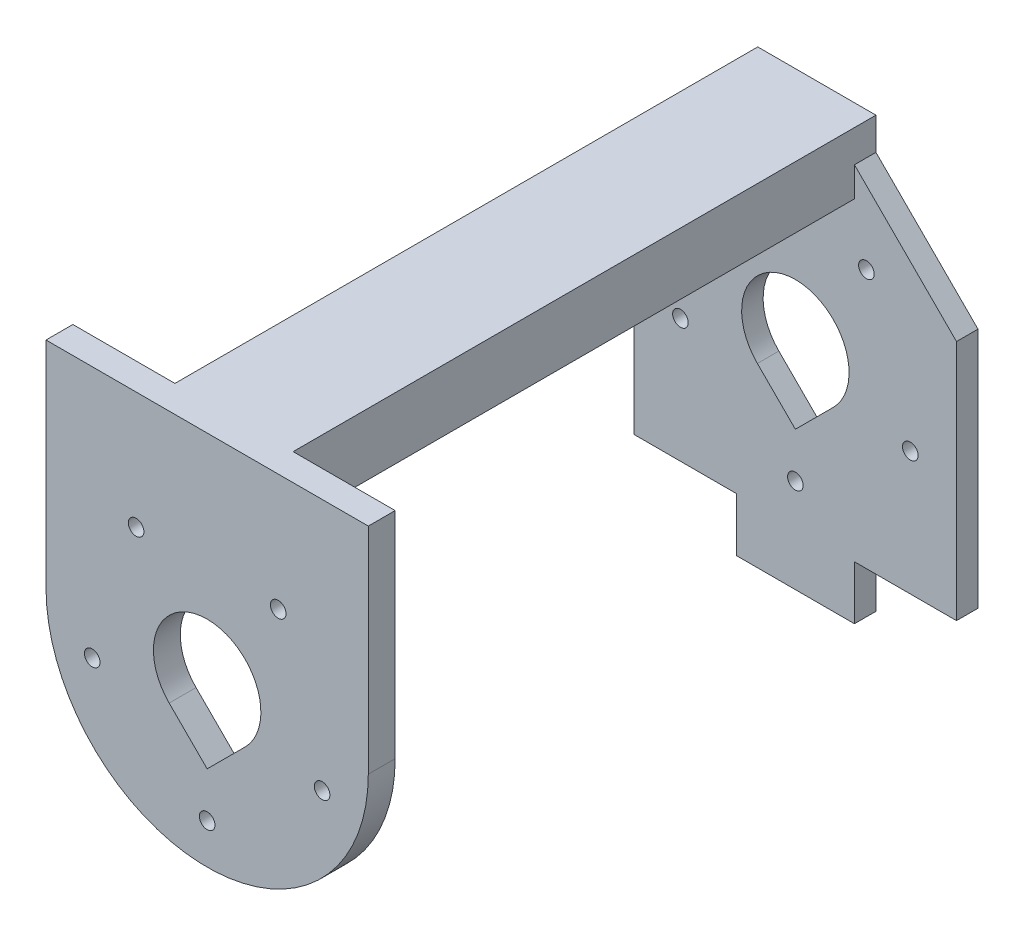
ISO-10303-21;
HEADER;
FILE_DESCRIPTION(('STEP AP214'),'2;1');
FILE_NAME('part.step','',(''),(''),'','','');
FILE_SCHEMA(('AUTOMOTIVE_DESIGN { 1 0 10303 214 1 1 1 1 }'));
ENDSEC;
DATA;
#1=APPLICATION_CONTEXT('core data for automotive mechanical design processes');
#2=APPLICATION_PROTOCOL_DEFINITION('international standard','automotive_design',2000,#1);
#3=PRODUCT_CONTEXT('',#1,'mechanical');
#4=PRODUCT('Part','Part','',(#3));
#5=PRODUCT_RELATED_PRODUCT_CATEGORY('part','',(#4));
#6=PRODUCT_DEFINITION_FORMATION('','',#4);
#7=PRODUCT_DEFINITION_CONTEXT('part definition',#1,'design');
#8=PRODUCT_DEFINITION('design','',#6,#7);
#9=PRODUCT_DEFINITION_SHAPE('','',#8);
#10=(LENGTH_UNIT() NAMED_UNIT(*) SI_UNIT(.MILLI.,.METRE.));
#11=(NAMED_UNIT(*) PLANE_ANGLE_UNIT() SI_UNIT($,.RADIAN.));
#12=(NAMED_UNIT(*) SI_UNIT($,.STERADIAN.) SOLID_ANGLE_UNIT());
#13=UNCERTAINTY_MEASURE_WITH_UNIT(LENGTH_MEASURE(1.E-05),#10,'distance_accuracy_value','');
#14=(GEOMETRIC_REPRESENTATION_CONTEXT(3) GLOBAL_UNCERTAINTY_ASSIGNED_CONTEXT((#13)) GLOBAL_UNIT_ASSIGNED_CONTEXT((#10,
#11,#12)) REPRESENTATION_CONTEXT('',''));
#15=CARTESIAN_POINT('',(0.,0.,0.));
#16=DIRECTION('',(0.,0.,1.));
#17=DIRECTION('',(1.,0.,0.));
#18=AXIS2_PLACEMENT_3D('',#15,#16,#17);
#19=CARTESIAN_POINT('',(289.,328.5,384.5));
#20=DIRECTION('',(0.,1.,0.));
#21=DIRECTION('',(0.,0.,1.));
#22=AXIS2_PLACEMENT_3D('',#19,#20,#21);
#23=PLANE('',#22);
#24=DIRECTION('',(-1.,0.,0.));
#25=VECTOR('',#24,1.);
#26=CARTESIAN_POINT('',(289.,328.5,280.));
#27=LINE('',#26,#25);
#28=CARTESIAN_POINT('',(311.,328.5,280.));
#29=VERTEX_POINT('',#28);
#30=CARTESIAN_POINT('',(289.,328.5,280.));
#31=VERTEX_POINT('',#30);
#32=EDGE_CURVE('E300',#29,#31,#27,.T.);
#33=ORIENTED_EDGE('',*,*,#32,.F.);
#34=DIRECTION('',(0.,0.,-1.));
#35=VECTOR('',#34,1.);
#36=CARTESIAN_POINT('',(311.,328.5,384.5));
#37=LINE('',#36,#35);
#38=CARTESIAN_POINT('',(311.,328.5,384.5));
#39=VERTEX_POINT('',#38);
#40=EDGE_CURVE('E325',#39,#29,#37,.T.);
#41=ORIENTED_EDGE('',*,*,#40,.F.);
#42=DIRECTION('',(1.,0.,0.));
#43=VECTOR('',#42,1.);
#44=CARTESIAN_POINT('',(289.,328.5,384.5));
#45=LINE('',#44,#43);
#46=CARTESIAN_POINT('',(289.,328.5,384.5));
#47=VERTEX_POINT('',#46);
#48=EDGE_CURVE('E308',#47,#39,#45,.T.);
#49=ORIENTED_EDGE('',*,*,#48,.F.);
#50=DIRECTION('',(0.,0.,-1.));
#51=VECTOR('',#50,1.);
#52=CARTESIAN_POINT('',(289.,328.5,384.5));
#53=LINE('',#52,#51);
#54=EDGE_CURVE('E328',#47,#31,#53,.T.);
#55=ORIENTED_EDGE('',*,*,#54,.T.);
#56=EDGE_LOOP('',(#33,#41,#49,#55));
#57=FACE_BOUND('',#56,.T.);
#58=ADVANCED_FACE('F39',(#57),#23,.F.);
#59=CARTESIAN_POINT('',(311.,328.5,384.5));
#60=DIRECTION('',(-1.,0.,0.));
#61=DIRECTION('',(0.,0.,1.));
#62=AXIS2_PLACEMENT_3D('',#59,#60,#61);
#63=PLANE('',#62);
#64=DIRECTION('',(0.,1.,0.));
#65=VECTOR('',#64,1.);
#66=CARTESIAN_POINT('',(311.,328.5,276.));
#67=LINE('',#66,#65);
#68=CARTESIAN_POINT('',(311.,334.,276.));
#69=VERTEX_POINT('',#68);
#70=CARTESIAN_POINT('',(311.,340.,276.));
#71=VERTEX_POINT('',#70);
#72=EDGE_CURVE('E317',#69,#71,#67,.T.);
#73=ORIENTED_EDGE('',*,*,#72,.T.);
#74=DIRECTION('',(0.,0.,-1.));
#75=VECTOR('',#74,1.);
#76=CARTESIAN_POINT('',(311.,340.,384.5));
#77=LINE('',#76,#75);
#78=CARTESIAN_POINT('',(311.,340.,384.5));
#79=VERTEX_POINT('',#78);
#80=EDGE_CURVE('E323',#79,#71,#77,.T.);
#81=ORIENTED_EDGE('',*,*,#80,.F.);
#82=DIRECTION('',(0.,1.,0.));
#83=VECTOR('',#82,1.);
#84=CARTESIAN_POINT('',(311.,328.5,384.5));
#85=LINE('',#84,#83);
#86=EDGE_CURVE('E312',#39,#79,#85,.T.);
#87=ORIENTED_EDGE('',*,*,#86,.F.);
#88=ORIENTED_EDGE('',*,*,#40,.T.);
#89=DIRECTION('',(0.,-1.,0.));
#90=VECTOR('',#89,1.);
#91=CARTESIAN_POINT('',(311.,328.5,280.));
#92=LINE('',#91,#90);
#93=CARTESIAN_POINT('',(311.,334.,280.));
#94=VERTEX_POINT('',#93);
#95=EDGE_CURVE('E11',#94,#29,#92,.T.);
#96=ORIENTED_EDGE('',*,*,#95,.F.);
#97=DIRECTION('',(0.,0.,-1.));
#98=VECTOR('',#97,1.);
#99=CARTESIAN_POINT('',(311.,334.,280.));
#100=LINE('',#99,#98);
#101=EDGE_CURVE('E256',#94,#69,#100,.T.);
#102=ORIENTED_EDGE('',*,*,#101,.T.);
#103=EDGE_LOOP('',(#73,#81,#87,#88,#96,#102));
#104=FACE_BOUND('',#103,.T.);
#105=ADVANCED_FACE('F448',(#104),#63,.F.);
#106=CARTESIAN_POINT('',(300.,300.,389.5));
#107=DIRECTION('',(0.,0.,1.));
#108=DIRECTION('',(1.,0.,0.));
#109=AXIS2_PLACEMENT_3D('',#106,#107,#108);
#110=PLANE('',#109);
#111=CARTESIAN_POINT('',(278.601228383359,293.047117626564,389.5));
#112=DIRECTION('',(0.,0.,1.));
#113=DIRECTION('',(1.,0.,0.));
#114=AXIS2_PLACEMENT_3D('',#111,#112,#113);
#115=CIRCLE('',#114,1.45000000000001);
#116=CARTESIAN_POINT('',(280.051228383359,293.047117626564,389.5));
#117=VERTEX_POINT('',#116);
#118=EDGE_CURVE('E347',#117,#117,#115,.T.);
#119=ORIENTED_EDGE('',*,*,#118,.F.);
#120=EDGE_LOOP('',(#119));
#121=FACE_BOUND('',#120,.T.);
#122=CARTESIAN_POINT('',(321.398771616641,293.047117626564,389.5));
#123=DIRECTION('',(0.,0.,1.));
#124=DIRECTION('',(1.,0.,0.));
#125=AXIS2_PLACEMENT_3D('',#122,#123,#124);
#126=CIRCLE('',#125,1.45000000000001);
#127=CARTESIAN_POINT('',(322.848771616641,293.047117626564,389.5));
#128=VERTEX_POINT('',#127);
#129=EDGE_CURVE('E334',#128,#128,#126,.T.);
#130=ORIENTED_EDGE('',*,*,#129,.F.);
#131=EDGE_LOOP('',(#130));
#132=FACE_BOUND('',#131,.T.);
#133=DIRECTION('',(0.707106781186545,-0.70710678118655,0.));
#134=VECTOR('',#133,1.);
#135=CARTESIAN_POINT('',(292.928932188135,292.928932188135,389.5));
#136=LINE('',#135,#134);
#137=CARTESIAN_POINT('',(292.928932188135,292.928932188135,389.5));
#138=VERTEX_POINT('',#137);
#139=CARTESIAN_POINT('',(300.,285.857864376269,389.5));
#140=VERTEX_POINT('',#139);
#141=EDGE_CURVE('E363',#138,#140,#136,.T.);
#142=ORIENTED_EDGE('',*,*,#141,.F.);
#143=CARTESIAN_POINT('',(300.,300.,389.5));
#144=DIRECTION('',(0.,0.,1.));
#145=DIRECTION('',(1.,0.,0.));
#146=AXIS2_PLACEMENT_3D('',#143,#144,#145);
#147=CIRCLE('',#146,9.99999999999998);
#148=CARTESIAN_POINT('',(307.071067811865,292.928932188135,389.5));
#149=VERTEX_POINT('',#148);
#150=EDGE_CURVE('E361',#149,#138,#147,.T.);
#151=ORIENTED_EDGE('',*,*,#150,.F.);
#152=DIRECTION('',(0.707106781186547,0.707106781186547,0.));
#153=VECTOR('',#152,1.);
#154=CARTESIAN_POINT('',(300.,285.857864376269,389.5));
#155=LINE('',#154,#153);
#156=EDGE_CURVE('E367',#140,#149,#155,.T.);
#157=ORIENTED_EDGE('',*,*,#156,.F.);
#158=EDGE_LOOP('',(#142,#151,#157));
#159=FACE_BOUND('',#158,.T.);
#160=CARTESIAN_POINT('',(300.,300.,389.5));
#161=DIRECTION('',(0.,0.,1.));
#162=DIRECTION('',(1.,0.,0.));
#163=AXIS2_PLACEMENT_3D('',#160,#161,#162);
#164=CIRCLE('',#163,30.);
#165=CARTESIAN_POINT('',(270.,300.,389.5));
#166=VERTEX_POINT('',#165);
#167=CARTESIAN_POINT('',(330.,300.,389.5));
#168=VERTEX_POINT('',#167);
#169=EDGE_CURVE('E47',#166,#168,#164,.T.);
#170=ORIENTED_EDGE('',*,*,#169,.T.);
#171=DIRECTION('',(0.,1.,0.));
#172=VECTOR('',#171,1.);
#173=CARTESIAN_POINT('',(330.,300.,389.5));
#174=LINE('',#173,#172);
#175=CARTESIAN_POINT('',(330.,340.,389.5));
#176=VERTEX_POINT('',#175);
#177=EDGE_CURVE('E388',#168,#176,#174,.T.);
#178=ORIENTED_EDGE('',*,*,#177,.T.);
#179=DIRECTION('',(-1.,0.,0.));
#180=VECTOR('',#179,1.);
#181=CARTESIAN_POINT('',(330.,340.,389.5));
#182=LINE('',#181,#180);
#183=CARTESIAN_POINT('',(270.,340.,389.5));
#184=VERTEX_POINT('',#183);
#185=EDGE_CURVE('E391',#176,#184,#182,.T.);
#186=ORIENTED_EDGE('',*,*,#185,.T.);
#187=DIRECTION('',(0.,-1.,0.));
#188=VECTOR('',#187,1.);
#189=CARTESIAN_POINT('',(270.,340.,389.5));
#190=LINE('',#189,#188);
#191=EDGE_CURVE('E385',#184,#166,#190,.T.);
#192=ORIENTED_EDGE('',*,*,#191,.T.);
#193=EDGE_LOOP('',(#170,#178,#186,#192));
#194=FACE_BOUND('',#193,.T.);
#195=CARTESIAN_POINT('',(313.225168176581,318.202882373436,389.5));
#196=DIRECTION('',(0.,0.,1.));
#197=DIRECTION('',(1.,0.,0.));
#198=AXIS2_PLACEMENT_3D('',#195,#196,#197);
#199=CIRCLE('',#198,1.45000000000001);
#200=CARTESIAN_POINT('',(314.675168176581,318.202882373436,389.5));
#201=VERTEX_POINT('',#200);
#202=EDGE_CURVE('E330',#201,#201,#199,.T.);
#203=ORIENTED_EDGE('',*,*,#202,.F.);
#204=EDGE_LOOP('',(#203));
#205=FACE_BOUND('',#204,.T.);
#206=CARTESIAN_POINT('',(300.,277.5,389.5));
#207=DIRECTION('',(0.,0.,1.));
#208=DIRECTION('',(1.,0.,0.));
#209=AXIS2_PLACEMENT_3D('',#206,#207,#208);
#210=CIRCLE('',#209,1.45000000000001);
#211=CARTESIAN_POINT('',(301.45,277.5,389.5));
#212=VERTEX_POINT('',#211);
#213=EDGE_CURVE('E353',#212,#212,#210,.T.);
#214=ORIENTED_EDGE('',*,*,#213,.F.);
#215=EDGE_LOOP('',(#214));
#216=FACE_BOUND('',#215,.T.);
#217=CARTESIAN_POINT('',(286.774831823419,318.202882373436,389.5));
#218=DIRECTION('',(0.,0.,1.));
#219=DIRECTION('',(1.,0.,0.));
#220=AXIS2_PLACEMENT_3D('',#217,#218,#219);
#221=CIRCLE('',#220,1.45000000000001);
#222=CARTESIAN_POINT('',(288.224831823419,318.202882373436,389.5));
#223=VERTEX_POINT('',#222);
#224=EDGE_CURVE('E341',#223,#223,#221,.T.);
#225=ORIENTED_EDGE('',*,*,#224,.F.);
#226=EDGE_LOOP('',(#225));
#227=FACE_BOUND('',#226,.T.);
#228=ADVANCED_FACE('F434',(#121,#132,#159,#194,#205,#216,#227),#110,.T.);
#229=CARTESIAN_POINT('',(300.,300.,384.5));
#230=DIRECTION('',(0.,0.,1.));
#231=DIRECTION('',(1.,0.,0.));
#232=AXIS2_PLACEMENT_3D('',#229,#230,#231);
#233=PLANE('',#232);
#234=DIRECTION('',(-1.,0.,0.));
#235=VECTOR('',#234,1.);
#236=CARTESIAN_POINT('',(330.,340.,384.5));
#237=LINE('',#236,#235);
#238=CARTESIAN_POINT('',(289.,340.,384.5));
#239=VERTEX_POINT('',#238);
#240=CARTESIAN_POINT('',(270.,340.,384.5));
#241=VERTEX_POINT('',#240);
#242=EDGE_CURVE('E398',#239,#241,#237,.T.);
#243=ORIENTED_EDGE('',*,*,#242,.F.);
#244=DIRECTION('',(0.,-1.,0.));
#245=VECTOR('',#244,1.);
#246=CARTESIAN_POINT('',(289.,340.,384.5));
#247=LINE('',#246,#245);
#248=EDGE_CURVE('E305',#239,#47,#247,.T.);
#249=ORIENTED_EDGE('',*,*,#248,.T.);
#250=ORIENTED_EDGE('',*,*,#48,.T.);
#251=ORIENTED_EDGE('',*,*,#86,.T.);
#252=CARTESIAN_POINT('',(330.,340.,384.5));
#253=VERTEX_POINT('',#252);
#254=EDGE_CURVE('E389',#253,#79,#237,.T.);
#255=ORIENTED_EDGE('',*,*,#254,.F.);
#256=DIRECTION('',(0.,1.,0.));
#257=VECTOR('',#256,1.);
#258=CARTESIAN_POINT('',(330.,300.,384.5));
#259=LINE('',#258,#257);
#260=CARTESIAN_POINT('',(330.,300.,384.5));
#261=VERTEX_POINT('',#260);
#262=EDGE_CURVE('E396',#261,#253,#259,.T.);
#263=ORIENTED_EDGE('',*,*,#262,.F.);
#264=CARTESIAN_POINT('',(300.,300.,384.5));
#265=DIRECTION('',(0.,0.,1.));
#266=DIRECTION('',(1.,0.,0.));
#267=AXIS2_PLACEMENT_3D('',#264,#265,#266);
#268=CIRCLE('',#267,30.);
#269=CARTESIAN_POINT('',(270.,300.,384.5));
#270=VERTEX_POINT('',#269);
#271=EDGE_CURVE('E412',#270,#261,#268,.T.);
#272=ORIENTED_EDGE('',*,*,#271,.F.);
#273=DIRECTION('',(0.,-1.,0.));
#274=VECTOR('',#273,1.);
#275=CARTESIAN_POINT('',(270.,340.,384.5));
#276=LINE('',#275,#274);
#277=EDGE_CURVE('E384',#241,#270,#276,.T.);
#278=ORIENTED_EDGE('',*,*,#277,.F.);
#279=EDGE_LOOP('',(#243,#249,#250,#251,#255,#263,#272,#278));
#280=FACE_BOUND('',#279,.T.);
#281=CARTESIAN_POINT('',(300.,300.,384.5));
#282=DIRECTION('',(0.,0.,1.));
#283=DIRECTION('',(1.,0.,0.));
#284=AXIS2_PLACEMENT_3D('',#281,#282,#283);
#285=CIRCLE('',#284,9.99999999999998);
#286=CARTESIAN_POINT('',(307.071067811865,292.928932188135,384.5));
#287=VERTEX_POINT('',#286);
#288=CARTESIAN_POINT('',(292.928932188135,292.928932188135,384.5));
#289=VERTEX_POINT('',#288);
#290=EDGE_CURVE('E340',#287,#289,#285,.T.);
#291=ORIENTED_EDGE('',*,*,#290,.T.);
#292=DIRECTION('',(0.707106781186545,-0.70710678118655,0.));
#293=VECTOR('',#292,1.);
#294=CARTESIAN_POINT('',(292.928932188135,292.928932188135,384.5));
#295=LINE('',#294,#293);
#296=CARTESIAN_POINT('',(300.,285.857864376269,384.5));
#297=VERTEX_POINT('',#296);
#298=EDGE_CURVE('E372',#289,#297,#295,.T.);
#299=ORIENTED_EDGE('',*,*,#298,.T.);
#300=DIRECTION('',(0.707106781186547,0.707106781186547,0.));
#301=VECTOR('',#300,1.);
#302=CARTESIAN_POINT('',(300.,285.857864376269,384.5));
#303=LINE('',#302,#301);
#304=EDGE_CURVE('E364',#297,#287,#303,.T.);
#305=ORIENTED_EDGE('',*,*,#304,.T.);
#306=EDGE_LOOP('',(#291,#299,#305));
#307=FACE_BOUND('',#306,.T.);
#308=CARTESIAN_POINT('',(313.225168176581,318.202882373436,384.5));
#309=DIRECTION('',(0.,0.,1.));
#310=DIRECTION('',(1.,0.,0.));
#311=AXIS2_PLACEMENT_3D('',#308,#309,#310);
#312=CIRCLE('',#311,1.45000000000001);
#313=CARTESIAN_POINT('',(314.675168176581,318.202882373436,384.5));
#314=VERTEX_POINT('',#313);
#315=EDGE_CURVE('E331',#314,#314,#312,.T.);
#316=ORIENTED_EDGE('',*,*,#315,.T.);
#317=EDGE_LOOP('',(#316));
#318=FACE_BOUND('',#317,.T.);
#319=CARTESIAN_POINT('',(321.398771616641,293.047117626564,384.5));
#320=DIRECTION('',(0.,0.,1.));
#321=DIRECTION('',(1.,0.,0.));
#322=AXIS2_PLACEMENT_3D('',#319,#320,#321);
#323=CIRCLE('',#322,1.45000000000001);
#324=CARTESIAN_POINT('',(322.848771616641,293.047117626564,384.5));
#325=VERTEX_POINT('',#324);
#326=EDGE_CURVE('E356',#325,#325,#323,.T.);
#327=ORIENTED_EDGE('',*,*,#326,.T.);
#328=EDGE_LOOP('',(#327));
#329=FACE_BOUND('',#328,.T.);
#330=CARTESIAN_POINT('',(300.,277.5,384.5));
#331=DIRECTION('',(0.,0.,1.));
#332=DIRECTION('',(1.,0.,0.));
#333=AXIS2_PLACEMENT_3D('',#330,#331,#332);
#334=CIRCLE('',#333,1.45000000000001);
#335=CARTESIAN_POINT('',(301.45,277.5,384.5));
#336=VERTEX_POINT('',#335);
#337=EDGE_CURVE('E350',#336,#336,#334,.T.);
#338=ORIENTED_EDGE('',*,*,#337,.T.);
#339=EDGE_LOOP('',(#338));
#340=FACE_BOUND('',#339,.T.);
#341=CARTESIAN_POINT('',(278.601228383359,293.047117626564,384.5));
#342=DIRECTION('',(0.,0.,1.));
#343=DIRECTION('',(1.,0.,0.));
#344=AXIS2_PLACEMENT_3D('',#341,#342,#343);
#345=CIRCLE('',#344,1.45000000000001);
#346=CARTESIAN_POINT('',(280.051228383359,293.047117626564,384.5));
#347=VERTEX_POINT('',#346);
#348=EDGE_CURVE('E344',#347,#347,#345,.T.);
#349=ORIENTED_EDGE('',*,*,#348,.T.);
#350=EDGE_LOOP('',(#349));
#351=FACE_BOUND('',#350,.T.);
#352=CARTESIAN_POINT('',(286.774831823419,318.202882373436,384.5));
#353=DIRECTION('',(0.,0.,1.));
#354=DIRECTION('',(1.,0.,0.));
#355=AXIS2_PLACEMENT_3D('',#352,#353,#354);
#356=CIRCLE('',#355,1.45000000000001);
#357=CARTESIAN_POINT('',(288.224831823419,318.202882373436,384.5));
#358=VERTEX_POINT('',#357);
#359=EDGE_CURVE('E337',#358,#358,#356,.T.);
#360=ORIENTED_EDGE('',*,*,#359,.T.);
#361=EDGE_LOOP('',(#360));
#362=FACE_BOUND('',#361,.T.);
#363=ADVANCED_FACE('F425',(#280,#307,#318,#329,#340,#351,#362),#233,.F.);
#364=CARTESIAN_POINT('',(300.,300.,389.5));
#365=DIRECTION('',(0.,0.,-1.));
#366=DIRECTION('',(-1.,0.,0.));
#367=AXIS2_PLACEMENT_3D('',#364,#365,#366);
#368=CYLINDRICAL_SURFACE('',#367,30.);
#369=DIRECTION('',(0.,0.,-1.));
#370=VECTOR('',#369,1.);
#371=CARTESIAN_POINT('',(270.,300.,389.5));
#372=LINE('',#371,#370);
#373=EDGE_CURVE('E409',#166,#270,#372,.T.);
#374=ORIENTED_EDGE('',*,*,#373,.T.);
#375=ORIENTED_EDGE('',*,*,#271,.T.);
#376=DIRECTION('',(0.,0.,-1.));
#377=VECTOR('',#376,1.);
#378=CARTESIAN_POINT('',(330.,300.,389.5));
#379=LINE('',#378,#377);
#380=EDGE_CURVE('E406',#168,#261,#379,.T.);
#381=ORIENTED_EDGE('',*,*,#380,.F.);
#382=ORIENTED_EDGE('',*,*,#169,.F.);
#383=EDGE_LOOP('',(#374,#375,#381,#382));
#384=FACE_BOUND('',#383,.T.);
#385=ADVANCED_FACE('F41',(#384),#368,.T.);
#386=CARTESIAN_POINT('',(270.,340.,389.5));
#387=DIRECTION('',(1.,0.,0.));
#388=DIRECTION('',(0.,0.,-1.));
#389=AXIS2_PLACEMENT_3D('',#386,#387,#388);
#390=PLANE('',#389);
#391=ORIENTED_EDGE('',*,*,#277,.T.);
#392=ORIENTED_EDGE('',*,*,#373,.F.);
#393=ORIENTED_EDGE('',*,*,#191,.F.);
#394=DIRECTION('',(0.,0.,-1.));
#395=VECTOR('',#394,1.);
#396=CARTESIAN_POINT('',(270.,340.,389.5));
#397=LINE('',#396,#395);
#398=EDGE_CURVE('E393',#184,#241,#397,.T.);
#399=ORIENTED_EDGE('',*,*,#398,.T.);
#400=EDGE_LOOP('',(#391,#392,#393,#399));
#401=FACE_BOUND('',#400,.T.);
#402=ADVANCED_FACE('F437',(#401),#390,.F.);
#403=CARTESIAN_POINT('',(330.,300.,389.5));
#404=DIRECTION('',(-1.,0.,0.));
#405=DIRECTION('',(0.,0.,1.));
#406=AXIS2_PLACEMENT_3D('',#403,#404,#405);
#407=PLANE('',#406);
#408=ORIENTED_EDGE('',*,*,#262,.T.);
#409=DIRECTION('',(0.,0.,-1.));
#410=VECTOR('',#409,1.);
#411=CARTESIAN_POINT('',(330.,340.,389.5));
#412=LINE('',#411,#410);
#413=EDGE_CURVE('E403',#176,#253,#412,.T.);
#414=ORIENTED_EDGE('',*,*,#413,.F.);
#415=ORIENTED_EDGE('',*,*,#177,.F.);
#416=ORIENTED_EDGE('',*,*,#380,.T.);
#417=EDGE_LOOP('',(#408,#414,#415,#416));
#418=FACE_BOUND('',#417,.T.);
#419=ADVANCED_FACE('F421',(#418),#407,.F.);
#420=CARTESIAN_POINT('',(330.,340.,389.5));
#421=DIRECTION('',(0.,-1.,0.));
#422=DIRECTION('',(0.,0.,-1.));
#423=AXIS2_PLACEMENT_3D('',#420,#421,#422);
#424=PLANE('',#423);
#425=DIRECTION('',(-1.,0.,0.));
#426=VECTOR('',#425,1.);
#427=CARTESIAN_POINT('',(311.,340.,276.));
#428=LINE('',#427,#426);
#429=CARTESIAN_POINT('',(289.,340.,276.));
#430=VERTEX_POINT('',#429);
#431=EDGE_CURVE('E309',#71,#430,#428,.T.);
#432=ORIENTED_EDGE('',*,*,#431,.T.);
#433=DIRECTION('',(0.,0.,-1.));
#434=VECTOR('',#433,1.);
#435=CARTESIAN_POINT('',(289.,340.,384.5));
#436=LINE('',#435,#434);
#437=EDGE_CURVE('E315',#239,#430,#436,.T.);
#438=ORIENTED_EDGE('',*,*,#437,.F.);
#439=ORIENTED_EDGE('',*,*,#242,.T.);
#440=ORIENTED_EDGE('',*,*,#398,.F.);
#441=ORIENTED_EDGE('',*,*,#185,.F.);
#442=ORIENTED_EDGE('',*,*,#413,.T.);
#443=ORIENTED_EDGE('',*,*,#254,.T.);
#444=ORIENTED_EDGE('',*,*,#80,.T.);
#445=EDGE_LOOP('',(#432,#438,#439,#440,#441,#442,#443,#444));
#446=FACE_BOUND('',#445,.T.);
#447=ADVANCED_FACE('F429',(#446),#424,.F.);
#448=CARTESIAN_POINT('',(300.,300.,389.5));
#449=DIRECTION('',(0.,0.,-1.));
#450=DIRECTION('',(-1.,0.,0.));
#451=AXIS2_PLACEMENT_3D('',#448,#449,#450);
#452=CYLINDRICAL_SURFACE('',#451,9.99999999999998);
#453=ORIENTED_EDGE('',*,*,#290,.F.);
#454=DIRECTION('',(0.,0.,-1.));
#455=VECTOR('',#454,1.);
#456=CARTESIAN_POINT('',(307.071067811865,292.928932188135,389.5));
#457=LINE('',#456,#455);
#458=EDGE_CURVE('E369',#149,#287,#457,.T.);
#459=ORIENTED_EDGE('',*,*,#458,.F.);
#460=ORIENTED_EDGE('',*,*,#150,.T.);
#461=DIRECTION('',(0.,0.,-1.));
#462=VECTOR('',#461,1.);
#463=CARTESIAN_POINT('',(292.928932188135,292.928932188135,389.5));
#464=LINE('',#463,#462);
#465=EDGE_CURVE('E381',#138,#289,#464,.T.);
#466=ORIENTED_EDGE('',*,*,#465,.T.);
#467=EDGE_LOOP('',(#453,#459,#460,#466));
#468=FACE_BOUND('',#467,.T.);
#469=ADVANCED_FACE('F541',(#468),#452,.F.);
#470=CARTESIAN_POINT('',(292.928932188135,292.928932188135,389.5));
#471=DIRECTION('',(0.70710678118655,0.707106781186545,0.));
#472=DIRECTION('',(-0.707106781186545,0.70710678118655,0.));
#473=AXIS2_PLACEMENT_3D('',#470,#471,#472);
#474=PLANE('',#473);
#475=ORIENTED_EDGE('',*,*,#298,.F.);
#476=ORIENTED_EDGE('',*,*,#465,.F.);
#477=ORIENTED_EDGE('',*,*,#141,.T.);
#478=DIRECTION('',(0.,0.,-1.));
#479=VECTOR('',#478,1.);
#480=CARTESIAN_POINT('',(300.,285.857864376269,389.5));
#481=LINE('',#480,#479);
#482=EDGE_CURVE('E379',#140,#297,#481,.T.);
#483=ORIENTED_EDGE('',*,*,#482,.T.);
#484=EDGE_LOOP('',(#475,#476,#477,#483));
#485=FACE_BOUND('',#484,.T.);
#486=ADVANCED_FACE('F537',(#485),#474,.T.);
#487=CARTESIAN_POINT('',(300.,285.857864376269,389.5));
#488=DIRECTION('',(-0.707106781186548,0.707106781186548,0.));
#489=DIRECTION('',(-0.707106781186548,-0.707106781186548,0.));
#490=AXIS2_PLACEMENT_3D('',#487,#488,#489);
#491=PLANE('',#490);
#492=ORIENTED_EDGE('',*,*,#304,.F.);
#493=ORIENTED_EDGE('',*,*,#482,.F.);
#494=ORIENTED_EDGE('',*,*,#156,.T.);
#495=ORIENTED_EDGE('',*,*,#458,.T.);
#496=EDGE_LOOP('',(#492,#493,#494,#495));
#497=FACE_BOUND('',#496,.T.);
#498=ADVANCED_FACE('F520',(#497),#491,.T.);
#499=CARTESIAN_POINT('',(313.225168176581,318.202882373436,389.5));
#500=DIRECTION('',(0.,0.,-1.));
#501=DIRECTION('',(-1.,0.,0.));
#502=AXIS2_PLACEMENT_3D('',#499,#500,#501);
#503=CYLINDRICAL_SURFACE('',#502,1.45000000000001);
#504=ORIENTED_EDGE('',*,*,#202,.T.);
#505=EDGE_LOOP('',(#504));
#506=FACE_BOUND('',#505,.T.);
#507=ORIENTED_EDGE('',*,*,#315,.F.);
#508=EDGE_LOOP('',(#507));
#509=FACE_BOUND('',#508,.T.);
#510=ADVANCED_FACE('F516',(#506,#509),#503,.F.);
#511=CARTESIAN_POINT('',(321.398771616641,293.047117626564,389.5));
#512=DIRECTION('',(0.,0.,-1.));
#513=DIRECTION('',(-1.,0.,0.));
#514=AXIS2_PLACEMENT_3D('',#511,#512,#513);
#515=CYLINDRICAL_SURFACE('',#514,1.45000000000001);
#516=ORIENTED_EDGE('',*,*,#129,.T.);
#517=EDGE_LOOP('',(#516));
#518=FACE_BOUND('',#517,.T.);
#519=ORIENTED_EDGE('',*,*,#326,.F.);
#520=EDGE_LOOP('',(#519));
#521=FACE_BOUND('',#520,.T.);
#522=ADVANCED_FACE('F519',(#518,#521),#515,.F.);
#523=CARTESIAN_POINT('',(300.,277.5,389.5));
#524=DIRECTION('',(0.,0.,-1.));
#525=DIRECTION('',(-1.,0.,0.));
#526=AXIS2_PLACEMENT_3D('',#523,#524,#525);
#527=CYLINDRICAL_SURFACE('',#526,1.45000000000001);
#528=ORIENTED_EDGE('',*,*,#213,.T.);
#529=EDGE_LOOP('',(#528));
#530=FACE_BOUND('',#529,.T.);
#531=ORIENTED_EDGE('',*,*,#337,.F.);
#532=EDGE_LOOP('',(#531));
#533=FACE_BOUND('',#532,.T.);
#534=ADVANCED_FACE('F527',(#530,#533),#527,.F.);
#535=CARTESIAN_POINT('',(278.601228383359,293.047117626564,389.5));
#536=DIRECTION('',(0.,0.,-1.));
#537=DIRECTION('',(-1.,0.,0.));
#538=AXIS2_PLACEMENT_3D('',#535,#536,#537);
#539=CYLINDRICAL_SURFACE('',#538,1.45000000000001);
#540=ORIENTED_EDGE('',*,*,#118,.T.);
#541=EDGE_LOOP('',(#540));
#542=FACE_BOUND('',#541,.T.);
#543=ORIENTED_EDGE('',*,*,#348,.F.);
#544=EDGE_LOOP('',(#543));
#545=FACE_BOUND('',#544,.T.);
#546=ADVANCED_FACE('F523',(#542,#545),#539,.F.);
#547=CARTESIAN_POINT('',(286.774831823419,318.202882373436,389.5));
#548=DIRECTION('',(0.,0.,-1.));
#549=DIRECTION('',(-1.,0.,0.));
#550=AXIS2_PLACEMENT_3D('',#547,#548,#549);
#551=CYLINDRICAL_SURFACE('',#550,1.45000000000001);
#552=ORIENTED_EDGE('',*,*,#224,.T.);
#553=EDGE_LOOP('',(#552));
#554=FACE_BOUND('',#553,.T.);
#555=ORIENTED_EDGE('',*,*,#359,.F.);
#556=EDGE_LOOP('',(#555));
#557=FACE_BOUND('',#556,.T.);
#558=ADVANCED_FACE('F515',(#554,#557),#551,.F.);
#559=CARTESIAN_POINT('',(289.,340.,384.5));
#560=DIRECTION('',(1.,0.,0.));
#561=DIRECTION('',(0.,0.,-1.));
#562=AXIS2_PLACEMENT_3D('',#559,#560,#561);
#563=PLANE('',#562);
#564=DIRECTION('',(0.,0.,-1.));
#565=VECTOR('',#564,1.);
#566=CARTESIAN_POINT('',(289.,334.,280.));
#567=LINE('',#566,#565);
#568=CARTESIAN_POINT('',(289.,334.,280.));
#569=VERTEX_POINT('',#568);
#570=CARTESIAN_POINT('',(289.,334.,276.));
#571=VERTEX_POINT('',#570);
#572=EDGE_CURVE('E54',#569,#571,#567,.T.);
#573=ORIENTED_EDGE('',*,*,#572,.F.);
#574=DIRECTION('',(0.,1.,0.));
#575=VECTOR('',#574,1.);
#576=CARTESIAN_POINT('',(289.,340.,280.));
#577=LINE('',#576,#575);
#578=EDGE_CURVE('E58',#31,#569,#577,.T.);
#579=ORIENTED_EDGE('',*,*,#578,.F.);
#580=ORIENTED_EDGE('',*,*,#54,.F.);
#581=ORIENTED_EDGE('',*,*,#248,.F.);
#582=ORIENTED_EDGE('',*,*,#437,.T.);
#583=DIRECTION('',(0.,-1.,0.));
#584=VECTOR('',#583,1.);
#585=CARTESIAN_POINT('',(289.,340.,276.));
#586=LINE('',#585,#584);
#587=EDGE_CURVE('E304',#430,#571,#586,.T.);
#588=ORIENTED_EDGE('',*,*,#587,.T.);
#589=EDGE_LOOP('',(#573,#579,#580,#581,#582,#588));
#590=FACE_BOUND('',#589,.T.);
#591=ADVANCED_FACE('F441',(#590),#563,.F.);
#592=CARTESIAN_POINT('',(0.,0.,276.));
#593=DIRECTION('',(0.,0.,1.));
#594=DIRECTION('',(1.,0.,0.));
#595=AXIS2_PLACEMENT_3D('',#592,#593,#594);
#596=PLANE('',#595);
#597=ORIENTED_EDGE('',*,*,#587,.F.);
#598=ORIENTED_EDGE('',*,*,#431,.F.);
#599=ORIENTED_EDGE('',*,*,#72,.F.);
#600=DIRECTION('',(-0.707106781186547,0.707106781186547,0.));
#601=VECTOR('',#600,1.);
#602=CARTESIAN_POINT('',(311.,334.,276.));
#603=LINE('',#602,#601);
#604=CARTESIAN_POINT('',(330.,315.,276.));
#605=VERTEX_POINT('',#604);
#606=EDGE_CURVE('E239',#605,#69,#603,.T.);
#607=ORIENTED_EDGE('',*,*,#606,.F.);
#608=DIRECTION('',(0.,1.,0.));
#609=VECTOR('',#608,1.);
#610=CARTESIAN_POINT('',(330.,315.,276.));
#611=LINE('',#610,#609);
#612=CARTESIAN_POINT('',(330.,270.,276.));
#613=VERTEX_POINT('',#612);
#614=EDGE_CURVE('E270',#613,#605,#611,.T.);
#615=ORIENTED_EDGE('',*,*,#614,.F.);
#616=DIRECTION('',(1.,0.,0.));
#617=VECTOR('',#616,1.);
#618=CARTESIAN_POINT('',(330.,270.,276.));
#619=LINE('',#618,#617);
#620=CARTESIAN_POINT('',(311.,270.,276.));
#621=VERTEX_POINT('',#620);
#622=EDGE_CURVE('E268',#621,#613,#619,.T.);
#623=ORIENTED_EDGE('',*,*,#622,.F.);
#624=DIRECTION('',(0.,1.,0.));
#625=VECTOR('',#624,1.);
#626=CARTESIAN_POINT('',(311.,270.,276.));
#627=LINE('',#626,#625);
#628=CARTESIAN_POINT('',(311.,260.,276.));
#629=VERTEX_POINT('',#628);
#630=EDGE_CURVE('E266',#629,#621,#627,.T.);
#631=ORIENTED_EDGE('',*,*,#630,.F.);
#632=DIRECTION('',(1.,0.,0.));
#633=VECTOR('',#632,1.);
#634=CARTESIAN_POINT('',(311.,260.,276.));
#635=LINE('',#634,#633);
#636=CARTESIAN_POINT('',(289.,260.,276.));
#637=VERTEX_POINT('',#636);
#638=EDGE_CURVE('E264',#637,#629,#635,.T.);
#639=ORIENTED_EDGE('',*,*,#638,.F.);
#640=DIRECTION('',(0.,-1.,0.));
#641=VECTOR('',#640,1.);
#642=CARTESIAN_POINT('',(289.,260.,276.));
#643=LINE('',#642,#641);
#644=CARTESIAN_POINT('',(289.,270.,276.));
#645=VERTEX_POINT('',#644);
#646=EDGE_CURVE('E262',#645,#637,#643,.T.);
#647=ORIENTED_EDGE('',*,*,#646,.F.);
#648=DIRECTION('',(1.,0.,0.));
#649=VECTOR('',#648,1.);
#650=CARTESIAN_POINT('',(289.,270.,276.));
#651=LINE('',#650,#649);
#652=CARTESIAN_POINT('',(270.,270.,276.));
#653=VERTEX_POINT('',#652);
#654=EDGE_CURVE('E260',#653,#645,#651,.T.);
#655=ORIENTED_EDGE('',*,*,#654,.F.);
#656=DIRECTION('',(0.,-1.,0.));
#657=VECTOR('',#656,1.);
#658=CARTESIAN_POINT('',(270.,270.,276.));
#659=LINE('',#658,#657);
#660=CARTESIAN_POINT('',(270.,315.,276.));
#661=VERTEX_POINT('',#660);
#662=EDGE_CURVE('E258',#661,#653,#659,.T.);
#663=ORIENTED_EDGE('',*,*,#662,.F.);
#664=DIRECTION('',(-0.707106781186546,-0.707106781186549,0.));
#665=VECTOR('',#664,1.);
#666=CARTESIAN_POINT('',(270.,315.,276.));
#667=LINE('',#666,#665);
#668=EDGE_CURVE('E218',#571,#661,#667,.T.);
#669=ORIENTED_EDGE('',*,*,#668,.F.);
#670=EDGE_LOOP('',(#597,#598,#599,#607,#615,#623,#631,#639,#647,#655,#663,#669));
#671=FACE_BOUND('',#670,.T.);
#672=CARTESIAN_POINT('',(313.225168176581,318.202882373436,276.));
#673=DIRECTION('',(0.,0.,1.));
#674=DIRECTION('',(1.,0.,0.));
#675=AXIS2_PLACEMENT_3D('',#672,#673,#674);
#676=CIRCLE('',#675,1.45000000000001);
#677=CARTESIAN_POINT('',(314.675168176581,318.202882373436,276.));
#678=VERTEX_POINT('',#677);
#679=EDGE_CURVE('E818',#678,#678,#676,.T.);
#680=ORIENTED_EDGE('',*,*,#679,.T.);
#681=EDGE_LOOP('',(#680));
#682=FACE_BOUND('',#681,.T.);
#683=CARTESIAN_POINT('',(300.,277.5,276.));
#684=DIRECTION('',(0.,0.,1.));
#685=DIRECTION('',(1.,0.,0.));
#686=AXIS2_PLACEMENT_3D('',#683,#684,#685);
#687=CIRCLE('',#686,1.45000000000001);
#688=CARTESIAN_POINT('',(301.45,277.5,276.));
#689=VERTEX_POINT('',#688);
#690=EDGE_CURVE('E826',#689,#689,#687,.T.);
#691=ORIENTED_EDGE('',*,*,#690,.T.);
#692=EDGE_LOOP('',(#691));
#693=FACE_BOUND('',#692,.T.);
#694=CARTESIAN_POINT('',(286.774831823419,318.202882373436,276.));
#695=DIRECTION('',(0.,0.,1.));
#696=DIRECTION('',(1.,0.,0.));
#697=AXIS2_PLACEMENT_3D('',#694,#695,#696);
#698=CIRCLE('',#697,1.45000000000001);
#699=CARTESIAN_POINT('',(288.224831823419,318.202882373436,276.));
#700=VERTEX_POINT('',#699);
#701=EDGE_CURVE('E838',#700,#700,#698,.T.);
#702=ORIENTED_EDGE('',*,*,#701,.T.);
#703=EDGE_LOOP('',(#702));
#704=FACE_BOUND('',#703,.T.);
#705=DIRECTION('',(0.707106781186547,0.707106781186547,0.));
#706=VECTOR('',#705,1.);
#707=CARTESIAN_POINT('',(300.,285.857864376269,276.));
#708=LINE('',#707,#706);
#709=CARTESIAN_POINT('',(300.,285.857864376269,276.));
#710=VERTEX_POINT('',#709);
#711=CARTESIAN_POINT('',(307.071067811865,292.928932188134,276.));
#712=VERTEX_POINT('',#711);
#713=EDGE_CURVE('E211',#710,#712,#708,.T.);
#714=ORIENTED_EDGE('',*,*,#713,.T.);
#715=CARTESIAN_POINT('',(300.,300.,276.));
#716=DIRECTION('',(0.,0.,1.));
#717=DIRECTION('',(1.,0.,0.));
#718=AXIS2_PLACEMENT_3D('',#715,#716,#717);
#719=CIRCLE('',#718,9.99999999999998);
#720=CARTESIAN_POINT('',(292.928932188135,292.928932188135,276.));
#721=VERTEX_POINT('',#720);
#722=EDGE_CURVE('E228',#712,#721,#719,.T.);
#723=ORIENTED_EDGE('',*,*,#722,.T.);
#724=DIRECTION('',(0.707106781186545,-0.70710678118655,0.));
#725=VECTOR('',#724,1.);
#726=CARTESIAN_POINT('',(292.928932188135,292.928932188135,276.));
#727=LINE('',#726,#725);
#728=EDGE_CURVE('E217',#721,#710,#727,.T.);
#729=ORIENTED_EDGE('',*,*,#728,.T.);
#730=EDGE_LOOP('',(#714,#723,#729));
#731=FACE_BOUND('',#730,.T.);
#732=CARTESIAN_POINT('',(278.601228383359,293.047117626564,276.));
#733=DIRECTION('',(0.,0.,1.));
#734=DIRECTION('',(1.,0.,0.));
#735=AXIS2_PLACEMENT_3D('',#732,#733,#734);
#736=CIRCLE('',#735,1.45000000000001);
#737=CARTESIAN_POINT('',(280.051228383359,293.047117626564,276.));
#738=VERTEX_POINT('',#737);
#739=EDGE_CURVE('E832',#738,#738,#736,.T.);
#740=ORIENTED_EDGE('',*,*,#739,.T.);
#741=EDGE_LOOP('',(#740));
#742=FACE_BOUND('',#741,.T.);
#743=CARTESIAN_POINT('',(321.398771616641,293.047117626564,276.));
#744=DIRECTION('',(0.,0.,1.));
#745=DIRECTION('',(1.,0.,0.));
#746=AXIS2_PLACEMENT_3D('',#743,#744,#745);
#747=CIRCLE('',#746,1.45000000000001);
#748=CARTESIAN_POINT('',(322.848771616641,293.047117626564,276.));
#749=VERTEX_POINT('',#748);
#750=EDGE_CURVE('E820',#749,#749,#747,.T.);
#751=ORIENTED_EDGE('',*,*,#750,.T.);
#752=EDGE_LOOP('',(#751));
#753=FACE_BOUND('',#752,.T.);
#754=ADVANCED_FACE('F452',(#671,#682,#693,#704,#731,#742,#753),#596,.F.);
#755=CARTESIAN_POINT('',(0.,0.,280.));
#756=DIRECTION('',(0.,0.,-1.));
#757=DIRECTION('',(-1.,0.,0.));
#758=AXIS2_PLACEMENT_3D('',#755,#756,#757);
#759=PLANE('',#758);
#760=CARTESIAN_POINT('',(300.,300.,280.));
#761=DIRECTION('',(0.,0.,1.));
#762=DIRECTION('',(1.,0.,0.));
#763=AXIS2_PLACEMENT_3D('',#760,#761,#762);
#764=CIRCLE('',#763,9.99999999999998);
#765=CARTESIAN_POINT('',(307.071067811865,292.928932188135,280.));
#766=VERTEX_POINT('',#765);
#767=CARTESIAN_POINT('',(292.928932188135,292.928932188135,280.));
#768=VERTEX_POINT('',#767);
#769=EDGE_CURVE('E200',#766,#768,#764,.T.);
#770=ORIENTED_EDGE('',*,*,#769,.F.);
#771=DIRECTION('',(0.707106781186547,0.707106781186547,0.));
#772=VECTOR('',#771,1.);
#773=CARTESIAN_POINT('',(300.,285.857864376269,280.));
#774=LINE('',#773,#772);
#775=CARTESIAN_POINT('',(300.,285.857864376269,280.));
#776=VERTEX_POINT('',#775);
#777=EDGE_CURVE('E223',#776,#766,#774,.T.);
#778=ORIENTED_EDGE('',*,*,#777,.F.);
#779=DIRECTION('',(0.707106781186545,-0.70710678118655,0.));
#780=VECTOR('',#779,1.);
#781=CARTESIAN_POINT('',(292.928932188135,292.928932188135,280.));
#782=LINE('',#781,#780);
#783=EDGE_CURVE('E210',#768,#776,#782,.T.);
#784=ORIENTED_EDGE('',*,*,#783,.F.);
#785=EDGE_LOOP('',(#770,#778,#784));
#786=FACE_BOUND('',#785,.T.);
#787=CARTESIAN_POINT('',(286.774831823419,318.202882373436,280.));
#788=DIRECTION('',(0.,0.,1.));
#789=DIRECTION('',(1.,0.,0.));
#790=AXIS2_PLACEMENT_3D('',#787,#788,#789);
#791=CIRCLE('',#790,1.45000000000001);
#792=CARTESIAN_POINT('',(288.224831823419,318.202882373436,280.));
#793=VERTEX_POINT('',#792);
#794=EDGE_CURVE('E230',#793,#793,#791,.T.);
#795=ORIENTED_EDGE('',*,*,#794,.F.);
#796=EDGE_LOOP('',(#795));
#797=FACE_BOUND('',#796,.T.);
#798=CARTESIAN_POINT('',(278.601228383359,293.047117626564,280.));
#799=DIRECTION('',(0.,0.,1.));
#800=DIRECTION('',(1.,0.,0.));
#801=AXIS2_PLACEMENT_3D('',#798,#799,#800);
#802=CIRCLE('',#801,1.45000000000001);
#803=CARTESIAN_POINT('',(280.051228383359,293.047117626564,280.));
#804=VERTEX_POINT('',#803);
#805=EDGE_CURVE('E835',#804,#804,#802,.T.);
#806=ORIENTED_EDGE('',*,*,#805,.F.);
#807=EDGE_LOOP('',(#806));
#808=FACE_BOUND('',#807,.T.);
#809=CARTESIAN_POINT('',(300.,277.5,280.));
#810=DIRECTION('',(0.,0.,1.));
#811=DIRECTION('',(1.,0.,0.));
#812=AXIS2_PLACEMENT_3D('',#809,#810,#811);
#813=CIRCLE('',#812,1.45000000000001);
#814=CARTESIAN_POINT('',(301.45,277.5,280.));
#815=VERTEX_POINT('',#814);
#816=EDGE_CURVE('E829',#815,#815,#813,.T.);
#817=ORIENTED_EDGE('',*,*,#816,.F.);
#818=EDGE_LOOP('',(#817));
#819=FACE_BOUND('',#818,.T.);
#820=CARTESIAN_POINT('',(321.398771616641,293.047117626564,280.));
#821=DIRECTION('',(0.,0.,1.));
#822=DIRECTION('',(1.,0.,0.));
#823=AXIS2_PLACEMENT_3D('',#820,#821,#822);
#824=CIRCLE('',#823,1.45000000000001);
#825=CARTESIAN_POINT('',(322.848771616641,293.047117626564,280.));
#826=VERTEX_POINT('',#825);
#827=EDGE_CURVE('E823',#826,#826,#824,.T.);
#828=ORIENTED_EDGE('',*,*,#827,.F.);
#829=EDGE_LOOP('',(#828));
#830=FACE_BOUND('',#829,.T.);
#831=CARTESIAN_POINT('',(313.225168176581,318.202882373436,280.));
#832=DIRECTION('',(0.,0.,1.));
#833=DIRECTION('',(1.,0.,0.));
#834=AXIS2_PLACEMENT_3D('',#831,#832,#833);
#835=CIRCLE('',#834,1.45000000000001);
#836=CARTESIAN_POINT('',(314.675168176581,318.202882373436,280.));
#837=VERTEX_POINT('',#836);
#838=EDGE_CURVE('E815',#837,#837,#835,.T.);
#839=ORIENTED_EDGE('',*,*,#838,.F.);
#840=EDGE_LOOP('',(#839));
#841=FACE_BOUND('',#840,.T.);
#842=ORIENTED_EDGE('',*,*,#32,.T.);
#843=ORIENTED_EDGE('',*,*,#578,.T.);
#844=DIRECTION('',(-0.707106781186546,-0.707106781186549,0.));
#845=VECTOR('',#844,1.);
#846=CARTESIAN_POINT('',(270.,315.,280.));
#847=LINE('',#846,#845);
#848=CARTESIAN_POINT('',(270.,315.,280.));
#849=VERTEX_POINT('',#848);
#850=EDGE_CURVE('E236',#569,#849,#847,.T.);
#851=ORIENTED_EDGE('',*,*,#850,.T.);
#852=DIRECTION('',(0.,-1.,0.));
#853=VECTOR('',#852,1.);
#854=CARTESIAN_POINT('',(270.,270.,280.));
#855=LINE('',#854,#853);
#856=CARTESIAN_POINT('',(270.,270.,280.));
#857=VERTEX_POINT('',#856);
#858=EDGE_CURVE('E238',#849,#857,#855,.T.);
#859=ORIENTED_EDGE('',*,*,#858,.T.);
#860=DIRECTION('',(1.,0.,0.));
#861=VECTOR('',#860,1.);
#862=CARTESIAN_POINT('',(289.,270.,280.));
#863=LINE('',#862,#861);
#864=CARTESIAN_POINT('',(289.,270.,280.));
#865=VERTEX_POINT('',#864);
#866=EDGE_CURVE('E241',#857,#865,#863,.T.);
#867=ORIENTED_EDGE('',*,*,#866,.T.);
#868=DIRECTION('',(0.,-1.,0.));
#869=VECTOR('',#868,1.);
#870=CARTESIAN_POINT('',(289.,260.,280.));
#871=LINE('',#870,#869);
#872=CARTESIAN_POINT('',(289.,260.,280.));
#873=VERTEX_POINT('',#872);
#874=EDGE_CURVE('E243',#865,#873,#871,.T.);
#875=ORIENTED_EDGE('',*,*,#874,.T.);
#876=DIRECTION('',(1.,0.,0.));
#877=VECTOR('',#876,1.);
#878=CARTESIAN_POINT('',(311.,260.,280.));
#879=LINE('',#878,#877);
#880=CARTESIAN_POINT('',(311.,260.,280.));
#881=VERTEX_POINT('',#880);
#882=EDGE_CURVE('E245',#873,#881,#879,.T.);
#883=ORIENTED_EDGE('',*,*,#882,.T.);
#884=DIRECTION('',(0.,1.,0.));
#885=VECTOR('',#884,1.);
#886=CARTESIAN_POINT('',(311.,270.,280.));
#887=LINE('',#886,#885);
#888=CARTESIAN_POINT('',(311.,270.,280.));
#889=VERTEX_POINT('',#888);
#890=EDGE_CURVE('E247',#881,#889,#887,.T.);
#891=ORIENTED_EDGE('',*,*,#890,.T.);
#892=DIRECTION('',(1.,0.,0.));
#893=VECTOR('',#892,1.);
#894=CARTESIAN_POINT('',(330.,270.,280.));
#895=LINE('',#894,#893);
#896=CARTESIAN_POINT('',(330.,270.,280.));
#897=VERTEX_POINT('',#896);
#898=EDGE_CURVE('E249',#889,#897,#895,.T.);
#899=ORIENTED_EDGE('',*,*,#898,.T.);
#900=DIRECTION('',(0.,1.,0.));
#901=VECTOR('',#900,1.);
#902=CARTESIAN_POINT('',(330.,315.,280.));
#903=LINE('',#902,#901);
#904=CARTESIAN_POINT('',(330.,315.,280.));
#905=VERTEX_POINT('',#904);
#906=EDGE_CURVE('E251',#897,#905,#903,.T.);
#907=ORIENTED_EDGE('',*,*,#906,.T.);
#908=DIRECTION('',(-0.707106781186547,0.707106781186547,0.));
#909=VECTOR('',#908,1.);
#910=CARTESIAN_POINT('',(311.,334.,280.));
#911=LINE('',#910,#909);
#912=EDGE_CURVE('E253',#905,#94,#911,.T.);
#913=ORIENTED_EDGE('',*,*,#912,.T.);
#914=ORIENTED_EDGE('',*,*,#95,.T.);
#915=EDGE_LOOP('',(#842,#843,#851,#859,#867,#875,#883,#891,#899,#907,#913,#914));
#916=FACE_BOUND('',#915,.T.);
#917=ADVANCED_FACE('F221',(#786,#797,#808,#819,#830,#841,#916),#759,.F.);
#918=CARTESIAN_POINT('',(270.,315.,280.));
#919=DIRECTION('',(0.707106781186549,-0.707106781186546,0.));
#920=DIRECTION('',(0.707106781186546,0.707106781186549,0.));
#921=AXIS2_PLACEMENT_3D('',#918,#919,#920);
#922=PLANE('',#921);
#923=ORIENTED_EDGE('',*,*,#668,.T.);
#924=DIRECTION('',(0.,0.,-1.));
#925=VECTOR('',#924,1.);
#926=CARTESIAN_POINT('',(270.,315.,280.));
#927=LINE('',#926,#925);
#928=EDGE_CURVE('E296',#849,#661,#927,.T.);
#929=ORIENTED_EDGE('',*,*,#928,.F.);
#930=ORIENTED_EDGE('',*,*,#850,.F.);
#931=ORIENTED_EDGE('',*,*,#572,.T.);
#932=EDGE_LOOP('',(#923,#929,#930,#931));
#933=FACE_BOUND('',#932,.T.);
#934=ADVANCED_FACE('F459',(#933),#922,.F.);
#935=CARTESIAN_POINT('',(270.,270.,280.));
#936=DIRECTION('',(1.,0.,0.));
#937=DIRECTION('',(0.,0.,-1.));
#938=AXIS2_PLACEMENT_3D('',#935,#936,#937);
#939=PLANE('',#938);
#940=ORIENTED_EDGE('',*,*,#662,.T.);
#941=DIRECTION('',(0.,0.,-1.));
#942=VECTOR('',#941,1.);
#943=CARTESIAN_POINT('',(270.,270.,280.));
#944=LINE('',#943,#942);
#945=EDGE_CURVE('E293',#857,#653,#944,.T.);
#946=ORIENTED_EDGE('',*,*,#945,.F.);
#947=ORIENTED_EDGE('',*,*,#858,.F.);
#948=ORIENTED_EDGE('',*,*,#928,.T.);
#949=EDGE_LOOP('',(#940,#946,#947,#948));
#950=FACE_BOUND('',#949,.T.);
#951=ADVANCED_FACE('F465',(#950),#939,.F.);
#952=CARTESIAN_POINT('',(289.,270.,280.));
#953=DIRECTION('',(0.,1.,0.));
#954=DIRECTION('',(0.,0.,1.));
#955=AXIS2_PLACEMENT_3D('',#952,#953,#954);
#956=PLANE('',#955);
#957=ORIENTED_EDGE('',*,*,#654,.T.);
#958=DIRECTION('',(0.,0.,-1.));
#959=VECTOR('',#958,1.);
#960=CARTESIAN_POINT('',(289.,270.,280.));
#961=LINE('',#960,#959);
#962=EDGE_CURVE('E290',#865,#645,#961,.T.);
#963=ORIENTED_EDGE('',*,*,#962,.F.);
#964=ORIENTED_EDGE('',*,*,#866,.F.);
#965=ORIENTED_EDGE('',*,*,#945,.T.);
#966=EDGE_LOOP('',(#957,#963,#964,#965));
#967=FACE_BOUND('',#966,.T.);
#968=ADVANCED_FACE('F467',(#967),#956,.F.);
#969=CARTESIAN_POINT('',(289.,260.,280.));
#970=DIRECTION('',(1.,0.,0.));
#971=DIRECTION('',(0.,0.,-1.));
#972=AXIS2_PLACEMENT_3D('',#969,#970,#971);
#973=PLANE('',#972);
#974=ORIENTED_EDGE('',*,*,#646,.T.);
#975=DIRECTION('',(0.,0.,-1.));
#976=VECTOR('',#975,1.);
#977=CARTESIAN_POINT('',(289.,260.,280.));
#978=LINE('',#977,#976);
#979=EDGE_CURVE('E287',#873,#637,#978,.T.);
#980=ORIENTED_EDGE('',*,*,#979,.F.);
#981=ORIENTED_EDGE('',*,*,#874,.F.);
#982=ORIENTED_EDGE('',*,*,#962,.T.);
#983=EDGE_LOOP('',(#974,#980,#981,#982));
#984=FACE_BOUND('',#983,.T.);
#985=ADVANCED_FACE('F472',(#984),#973,.F.);
#986=CARTESIAN_POINT('',(311.,260.,280.));
#987=DIRECTION('',(0.,1.,0.));
#988=DIRECTION('',(0.,0.,1.));
#989=AXIS2_PLACEMENT_3D('',#986,#987,#988);
#990=PLANE('',#989);
#991=ORIENTED_EDGE('',*,*,#638,.T.);
#992=DIRECTION('',(0.,0.,-1.));
#993=VECTOR('',#992,1.);
#994=CARTESIAN_POINT('',(311.,260.,280.));
#995=LINE('',#994,#993);
#996=EDGE_CURVE('E284',#881,#629,#995,.T.);
#997=ORIENTED_EDGE('',*,*,#996,.F.);
#998=ORIENTED_EDGE('',*,*,#882,.F.);
#999=ORIENTED_EDGE('',*,*,#979,.T.);
#1000=EDGE_LOOP('',(#991,#997,#998,#999));
#1001=FACE_BOUND('',#1000,.T.);
#1002=ADVANCED_FACE('F478',(#1001),#990,.F.);
#1003=CARTESIAN_POINT('',(311.,270.,280.));
#1004=DIRECTION('',(-1.,0.,0.));
#1005=DIRECTION('',(0.,0.,1.));
#1006=AXIS2_PLACEMENT_3D('',#1003,#1004,#1005);
#1007=PLANE('',#1006);
#1008=ORIENTED_EDGE('',*,*,#630,.T.);
#1009=DIRECTION('',(0.,0.,-1.));
#1010=VECTOR('',#1009,1.);
#1011=CARTESIAN_POINT('',(311.,270.,280.));
#1012=LINE('',#1011,#1010);
#1013=EDGE_CURVE('E281',#889,#621,#1012,.T.);
#1014=ORIENTED_EDGE('',*,*,#1013,.F.);
#1015=ORIENTED_EDGE('',*,*,#890,.F.);
#1016=ORIENTED_EDGE('',*,*,#996,.T.);
#1017=EDGE_LOOP('',(#1008,#1014,#1015,#1016));
#1018=FACE_BOUND('',#1017,.T.);
#1019=ADVANCED_FACE('F482',(#1018),#1007,.F.);
#1020=CARTESIAN_POINT('',(330.,270.,280.));
#1021=DIRECTION('',(0.,1.,0.));
#1022=DIRECTION('',(0.,0.,1.));
#1023=AXIS2_PLACEMENT_3D('',#1020,#1021,#1022);
#1024=PLANE('',#1023);
#1025=ORIENTED_EDGE('',*,*,#622,.T.);
#1026=DIRECTION('',(0.,0.,-1.));
#1027=VECTOR('',#1026,1.);
#1028=CARTESIAN_POINT('',(330.,270.,280.));
#1029=LINE('',#1028,#1027);
#1030=EDGE_CURVE('E278',#897,#613,#1029,.T.);
#1031=ORIENTED_EDGE('',*,*,#1030,.F.);
#1032=ORIENTED_EDGE('',*,*,#898,.F.);
#1033=ORIENTED_EDGE('',*,*,#1013,.T.);
#1034=EDGE_LOOP('',(#1025,#1031,#1032,#1033));
#1035=FACE_BOUND('',#1034,.T.);
#1036=ADVANCED_FACE('F487',(#1035),#1024,.F.);
#1037=CARTESIAN_POINT('',(330.,315.,280.));
#1038=DIRECTION('',(-1.,0.,0.));
#1039=DIRECTION('',(0.,0.,1.));
#1040=AXIS2_PLACEMENT_3D('',#1037,#1038,#1039);
#1041=PLANE('',#1040);
#1042=ORIENTED_EDGE('',*,*,#614,.T.);
#1043=DIRECTION('',(0.,0.,-1.));
#1044=VECTOR('',#1043,1.);
#1045=CARTESIAN_POINT('',(330.,315.,280.));
#1046=LINE('',#1045,#1044);
#1047=EDGE_CURVE('E275',#905,#605,#1046,.T.);
#1048=ORIENTED_EDGE('',*,*,#1047,.F.);
#1049=ORIENTED_EDGE('',*,*,#906,.F.);
#1050=ORIENTED_EDGE('',*,*,#1030,.T.);
#1051=EDGE_LOOP('',(#1042,#1048,#1049,#1050));
#1052=FACE_BOUND('',#1051,.T.);
#1053=ADVANCED_FACE('F491',(#1052),#1041,.F.);
#1054=CARTESIAN_POINT('',(311.,334.,280.));
#1055=DIRECTION('',(-0.707106781186547,-0.707106781186547,0.));
#1056=DIRECTION('',(0.707106781186548,-0.707106781186548,0.));
#1057=AXIS2_PLACEMENT_3D('',#1054,#1055,#1056);
#1058=PLANE('',#1057);
#1059=ORIENTED_EDGE('',*,*,#606,.T.);
#1060=ORIENTED_EDGE('',*,*,#101,.F.);
#1061=ORIENTED_EDGE('',*,*,#912,.F.);
#1062=ORIENTED_EDGE('',*,*,#1047,.T.);
#1063=EDGE_LOOP('',(#1059,#1060,#1061,#1062));
#1064=FACE_BOUND('',#1063,.T.);
#1065=ADVANCED_FACE('F494',(#1064),#1058,.F.);
#1066=CARTESIAN_POINT('',(300.,300.,280.));
#1067=DIRECTION('',(0.,0.,-1.));
#1068=DIRECTION('',(-1.,0.,0.));
#1069=AXIS2_PLACEMENT_3D('',#1066,#1067,#1068);
#1070=CYLINDRICAL_SURFACE('',#1069,9.99999999999998);
#1071=ORIENTED_EDGE('',*,*,#722,.F.);
#1072=DIRECTION('',(0.,0.,-1.));
#1073=VECTOR('',#1072,1.);
#1074=CARTESIAN_POINT('',(307.071067811865,292.928932188135,280.));
#1075=LINE('',#1074,#1073);
#1076=EDGE_CURVE('E206',#766,#712,#1075,.T.);
#1077=ORIENTED_EDGE('',*,*,#1076,.F.);
#1078=ORIENTED_EDGE('',*,*,#769,.T.);
#1079=DIRECTION('',(0.,0.,-1.));
#1080=VECTOR('',#1079,1.);
#1081=CARTESIAN_POINT('',(292.928932188135,292.928932188135,280.));
#1082=LINE('',#1081,#1080);
#1083=EDGE_CURVE('E203',#768,#721,#1082,.T.);
#1084=ORIENTED_EDGE('',*,*,#1083,.T.);
#1085=EDGE_LOOP('',(#1071,#1077,#1078,#1084));
#1086=FACE_BOUND('',#1085,.T.);
#1087=ADVANCED_FACE('F202',(#1086),#1070,.F.);
#1088=CARTESIAN_POINT('',(292.928932188135,292.928932188135,280.));
#1089=DIRECTION('',(0.70710678118655,0.707106781186545,0.));
#1090=DIRECTION('',(-0.707106781186545,0.70710678118655,0.));
#1091=AXIS2_PLACEMENT_3D('',#1088,#1089,#1090);
#1092=PLANE('',#1091);
#1093=ORIENTED_EDGE('',*,*,#728,.F.);
#1094=ORIENTED_EDGE('',*,*,#1083,.F.);
#1095=ORIENTED_EDGE('',*,*,#783,.T.);
#1096=DIRECTION('',(0.,0.,-1.));
#1097=VECTOR('',#1096,1.);
#1098=CARTESIAN_POINT('',(300.,285.857864376269,280.));
#1099=LINE('',#1098,#1097);
#1100=EDGE_CURVE('E219',#776,#710,#1099,.T.);
#1101=ORIENTED_EDGE('',*,*,#1100,.T.);
#1102=EDGE_LOOP('',(#1093,#1094,#1095,#1101));
#1103=FACE_BOUND('',#1102,.T.);
#1104=ADVANCED_FACE('F215',(#1103),#1092,.T.);
#1105=CARTESIAN_POINT('',(300.,285.857864376269,280.));
#1106=DIRECTION('',(-0.707106781186547,0.707106781186547,0.));
#1107=DIRECTION('',(-0.707106781186548,-0.707106781186548,0.));
#1108=AXIS2_PLACEMENT_3D('',#1105,#1106,#1107);
#1109=PLANE('',#1108);
#1110=ORIENTED_EDGE('',*,*,#713,.F.);
#1111=ORIENTED_EDGE('',*,*,#1100,.F.);
#1112=ORIENTED_EDGE('',*,*,#777,.T.);
#1113=ORIENTED_EDGE('',*,*,#1076,.T.);
#1114=EDGE_LOOP('',(#1110,#1111,#1112,#1113));
#1115=FACE_BOUND('',#1114,.T.);
#1116=ADVANCED_FACE('F696',(#1115),#1109,.T.);
#1117=CARTESIAN_POINT('',(286.774831823419,318.202882373436,280.));
#1118=DIRECTION('',(0.,0.,-1.));
#1119=DIRECTION('',(-1.,0.,0.));
#1120=AXIS2_PLACEMENT_3D('',#1117,#1118,#1119);
#1121=CYLINDRICAL_SURFACE('',#1120,1.45000000000001);
#1122=ORIENTED_EDGE('',*,*,#794,.T.);
#1123=EDGE_LOOP('',(#1122));
#1124=FACE_BOUND('',#1123,.T.);
#1125=ORIENTED_EDGE('',*,*,#701,.F.);
#1126=EDGE_LOOP('',(#1125));
#1127=FACE_BOUND('',#1126,.T.);
#1128=ADVANCED_FACE('F704',(#1124,#1127),#1121,.F.);
#1129=CARTESIAN_POINT('',(278.601228383359,293.047117626564,280.));
#1130=DIRECTION('',(0.,0.,-1.));
#1131=DIRECTION('',(-1.,0.,0.));
#1132=AXIS2_PLACEMENT_3D('',#1129,#1130,#1131);
#1133=CYLINDRICAL_SURFACE('',#1132,1.45000000000001);
#1134=ORIENTED_EDGE('',*,*,#805,.T.);
#1135=EDGE_LOOP('',(#1134));
#1136=FACE_BOUND('',#1135,.T.);
#1137=ORIENTED_EDGE('',*,*,#739,.F.);
#1138=EDGE_LOOP('',(#1137));
#1139=FACE_BOUND('',#1138,.T.);
#1140=ADVANCED_FACE('F713',(#1136,#1139),#1133,.F.);
#1141=CARTESIAN_POINT('',(300.,277.5,280.));
#1142=DIRECTION('',(0.,0.,-1.));
#1143=DIRECTION('',(-1.,0.,0.));
#1144=AXIS2_PLACEMENT_3D('',#1141,#1142,#1143);
#1145=CYLINDRICAL_SURFACE('',#1144,1.45000000000001);
#1146=ORIENTED_EDGE('',*,*,#816,.T.);
#1147=EDGE_LOOP('',(#1146));
#1148=FACE_BOUND('',#1147,.T.);
#1149=ORIENTED_EDGE('',*,*,#690,.F.);
#1150=EDGE_LOOP('',(#1149));
#1151=FACE_BOUND('',#1150,.T.);
#1152=ADVANCED_FACE('F722',(#1148,#1151),#1145,.F.);
#1153=CARTESIAN_POINT('',(321.398771616641,293.047117626564,280.));
#1154=DIRECTION('',(0.,0.,-1.));
#1155=DIRECTION('',(-1.,0.,0.));
#1156=AXIS2_PLACEMENT_3D('',#1153,#1154,#1155);
#1157=CYLINDRICAL_SURFACE('',#1156,1.45000000000001);
#1158=ORIENTED_EDGE('',*,*,#827,.T.);
#1159=EDGE_LOOP('',(#1158));
#1160=FACE_BOUND('',#1159,.T.);
#1161=ORIENTED_EDGE('',*,*,#750,.F.);
#1162=EDGE_LOOP('',(#1161));
#1163=FACE_BOUND('',#1162,.T.);
#1164=ADVANCED_FACE('F731',(#1160,#1163),#1157,.F.);
#1165=CARTESIAN_POINT('',(313.225168176581,318.202882373436,280.));
#1166=DIRECTION('',(0.,0.,-1.));
#1167=DIRECTION('',(-1.,0.,0.));
#1168=AXIS2_PLACEMENT_3D('',#1165,#1166,#1167);
#1169=CYLINDRICAL_SURFACE('',#1168,1.45000000000001);
#1170=ORIENTED_EDGE('',*,*,#838,.T.);
#1171=EDGE_LOOP('',(#1170));
#1172=FACE_BOUND('',#1171,.T.);
#1173=ORIENTED_EDGE('',*,*,#679,.F.);
#1174=EDGE_LOOP('',(#1173));
#1175=FACE_BOUND('',#1174,.T.);
#1176=ADVANCED_FACE('F740',(#1172,#1175),#1169,.F.);
#1177=CLOSED_SHELL('',(#58,#105,#228,#363,#385,#402,#419,#447,#469,#486,#498,#510,#522,#534,
#546,#558,#591,#754,#917,#934,#951,#968,#985,#1002,#1019,#1036,#1053,#1065,#1087,#1104,#1116,
#1128,#1140,#1152,#1164,#1176));
#1178=MANIFOLD_SOLID_BREP('B2',#1177);
#1179=ADVANCED_BREP_SHAPE_REPRESENTATION('',(#18,#1178),#14);
#1180=SHAPE_DEFINITION_REPRESENTATION(#9,#1179);
ENDSEC;
END-ISO-10303-21;
